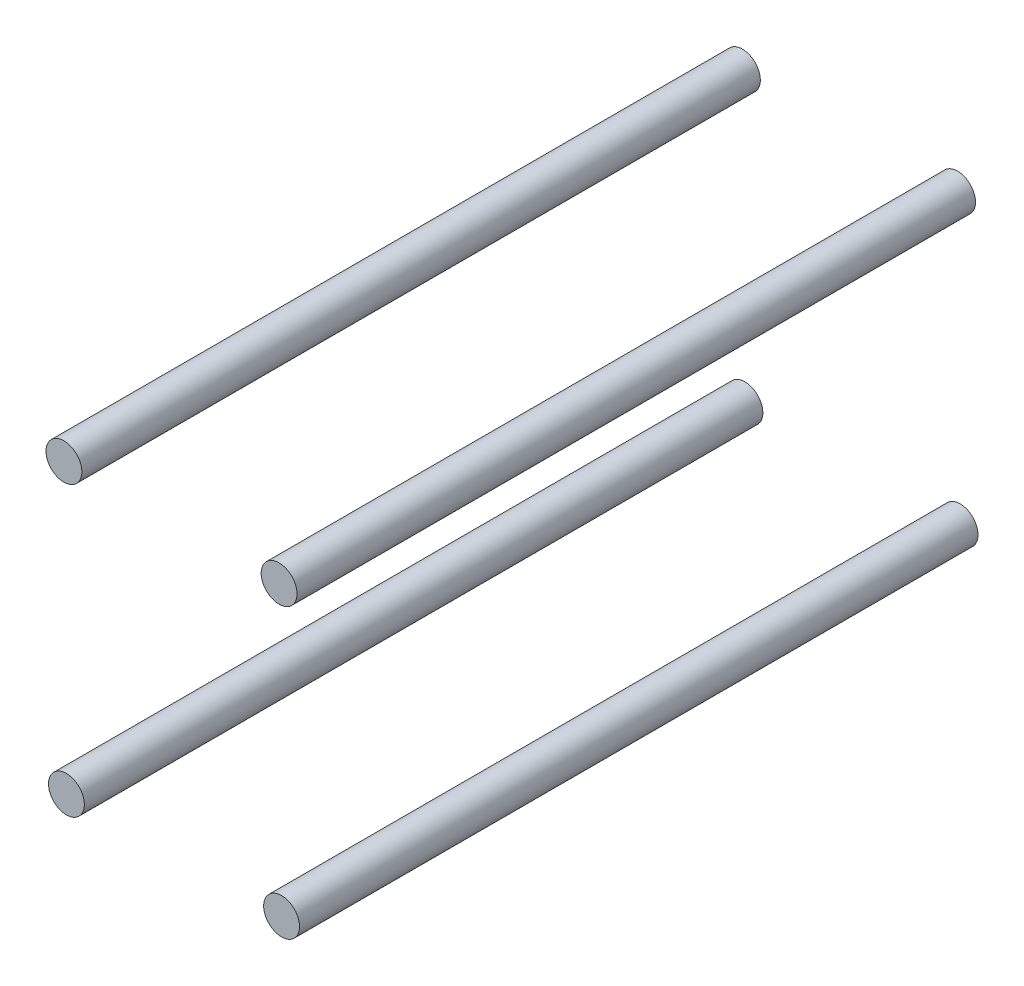
ISO-10303-21;
HEADER;
FILE_DESCRIPTION(('STEP AP214'),'2;1');
FILE_NAME('part.step','',(''),(''),'','','');
FILE_SCHEMA(('AUTOMOTIVE_DESIGN { 1 0 10303 214 1 1 1 1 }'));
ENDSEC;
DATA;
#1=APPLICATION_CONTEXT('core data for automotive mechanical design processes');
#2=APPLICATION_PROTOCOL_DEFINITION('international standard','automotive_design',2000,#1);
#3=PRODUCT_CONTEXT('',#1,'mechanical');
#4=PRODUCT('Part','Part','',(#3));
#5=PRODUCT_RELATED_PRODUCT_CATEGORY('part','',(#4));
#6=PRODUCT_DEFINITION_FORMATION('','',#4);
#7=PRODUCT_DEFINITION_CONTEXT('part definition',#1,'design');
#8=PRODUCT_DEFINITION('design','',#6,#7);
#9=PRODUCT_DEFINITION_SHAPE('','',#8);
#10=(LENGTH_UNIT() NAMED_UNIT(*) SI_UNIT(.MILLI.,.METRE.));
#11=(NAMED_UNIT(*) PLANE_ANGLE_UNIT() SI_UNIT($,.RADIAN.));
#12=(NAMED_UNIT(*) SI_UNIT($,.STERADIAN.) SOLID_ANGLE_UNIT());
#13=UNCERTAINTY_MEASURE_WITH_UNIT(LENGTH_MEASURE(1.E-05),#10,'distance_accuracy_value','');
#14=(GEOMETRIC_REPRESENTATION_CONTEXT(3) GLOBAL_UNCERTAINTY_ASSIGNED_CONTEXT((#13)) GLOBAL_UNIT_ASSIGNED_CONTEXT((#10,
#11,#12)) REPRESENTATION_CONTEXT('',''));
#15=CARTESIAN_POINT('',(0.,0.,0.));
#16=DIRECTION('',(0.,0.,1.));
#17=DIRECTION('',(1.,0.,0.));
#18=AXIS2_PLACEMENT_3D('',#15,#16,#17);
#19=CARTESIAN_POINT('',(3.80214117634224,9.09291491599282,6.42002499999992));
#20=DIRECTION('',(0.,0.,1.));
#21=DIRECTION('',(0.,-1.,0.));
#22=AXIS2_PLACEMENT_3D('',#19,#20,#21);
#23=PLANE('',#22);
#24=CARTESIAN_POINT('',(5.33699020293199,5.1061570269837,6.42002499999991));
#25=DIRECTION('',(0.,0.,1.));
#26=DIRECTION('',(0.,-1.,0.));
#27=AXIS2_PLACEMENT_3D('',#24,#25,#26);
#28=CIRCLE('',#27,0.25);
#29=CARTESIAN_POINT('',(5.33699020293199,4.8561570269837,6.42002499999991));
#30=VERTEX_POINT('',#29);
#31=EDGE_CURVE('P0_E18',#30,#30,#28,.F.);
#32=ORIENTED_EDGE('',*,*,#31,.F.);
#33=EDGE_LOOP('',(#32));
#34=FACE_BOUND('',#33,.T.);
#35=ADVANCED_FACE('P0_F15',(#34),#23,.T.);
#36=CARTESIAN_POINT('',(3.80214117634224,9.09291491599286,-3.03997500000008));
#37=DIRECTION('',(0.,0.,1.));
#38=DIRECTION('',(0.,-1.,0.));
#39=AXIS2_PLACEMENT_3D('',#36,#37,#38);
#40=PLANE('',#39);
#41=CARTESIAN_POINT('',(5.33699020293199,5.10615702698373,-3.03997500000009));
#42=DIRECTION('',(0.,0.,1.));
#43=DIRECTION('',(0.,-1.,0.));
#44=AXIS2_PLACEMENT_3D('',#41,#42,#43);
#45=CIRCLE('',#44,0.25);
#46=CARTESIAN_POINT('',(5.33699020293199,4.85615702698373,-3.03997500000009));
#47=VERTEX_POINT('',#46);
#48=EDGE_CURVE('P0_E10',#47,#47,#45,.T.);
#49=ORIENTED_EDGE('',*,*,#48,.F.);
#50=EDGE_LOOP('',(#49));
#51=FACE_BOUND('',#50,.T.);
#52=ADVANCED_FACE('P0_F30',(#51),#40,.F.);
#53=CARTESIAN_POINT('',(5.33699020293199,5.10615702698373,-3.03997500000009));
#54=DIRECTION('',(0.,0.,1.));
#55=DIRECTION('',(0.,-1.,0.));
#56=AXIS2_PLACEMENT_3D('',#53,#54,#55);
#57=CYLINDRICAL_SURFACE('',#56,0.25);
#58=ORIENTED_EDGE('',*,*,#31,.T.);
#59=EDGE_LOOP('',(#58));
#60=FACE_BOUND('',#59,.T.);
#61=ORIENTED_EDGE('',*,*,#48,.T.);
#62=EDGE_LOOP('',(#61));
#63=FACE_BOUND('',#62,.T.);
#64=ADVANCED_FACE('P0_F27',(#60,#63),#57,.T.);
#65=CLOSED_SHELL('',(#35,#52,#64));
#66=MANIFOLD_SOLID_BREP('P0_B1',#65);
#67=CARTESIAN_POINT('',(3.80214117634224,9.09291491599286,-3.03997500000008));
#68=DIRECTION('',(0.,0.,1.));
#69=DIRECTION('',(0.,-1.,0.));
#70=AXIS2_PLACEMENT_3D('',#67,#68,#69);
#71=PLANE('',#70);
#72=CARTESIAN_POINT('',(5.3020840609385,9.10600471924041,-3.03997500000008));
#73=DIRECTION('',(0.,0.,1.));
#74=DIRECTION('',(0.,-1.,0.));
#75=AXIS2_PLACEMENT_3D('',#72,#73,#74);
#76=CIRCLE('',#75,0.25);
#77=CARTESIAN_POINT('',(5.3020840609385,8.85600471924041,-3.03997500000008));
#78=VERTEX_POINT('',#77);
#79=EDGE_CURVE('P1_E18',#78,#78,#76,.T.);
#80=ORIENTED_EDGE('',*,*,#79,.F.);
#81=EDGE_LOOP('',(#80));
#82=FACE_BOUND('',#81,.T.);
#83=ADVANCED_FACE('P1_F15',(#82),#71,.F.);
#84=CARTESIAN_POINT('',(3.80214117634224,9.09291491599282,6.42002499999992));
#85=DIRECTION('',(0.,0.,1.));
#86=DIRECTION('',(0.,-1.,0.));
#87=AXIS2_PLACEMENT_3D('',#84,#85,#86);
#88=PLANE('',#87);
#89=CARTESIAN_POINT('',(5.3020840609385,9.10600471924037,6.42002499999992));
#90=DIRECTION('',(0.,0.,1.));
#91=DIRECTION('',(0.,-1.,0.));
#92=AXIS2_PLACEMENT_3D('',#89,#90,#91);
#93=CIRCLE('',#92,0.25);
#94=CARTESIAN_POINT('',(5.3020840609385,8.85600471924037,6.42002499999992));
#95=VERTEX_POINT('',#94);
#96=EDGE_CURVE('P1_E10',#95,#95,#93,.F.);
#97=ORIENTED_EDGE('',*,*,#96,.F.);
#98=EDGE_LOOP('',(#97));
#99=FACE_BOUND('',#98,.T.);
#100=ADVANCED_FACE('P1_F30',(#99),#88,.T.);
#101=CARTESIAN_POINT('',(5.3020840609385,9.10600471924041,-3.03997500000008));
#102=DIRECTION('',(0.,0.,1.));
#103=DIRECTION('',(0.,-1.,0.));
#104=AXIS2_PLACEMENT_3D('',#101,#102,#103);
#105=CYLINDRICAL_SURFACE('',#104,0.25);
#106=ORIENTED_EDGE('',*,*,#79,.T.);
#107=EDGE_LOOP('',(#106));
#108=FACE_BOUND('',#107,.T.);
#109=ORIENTED_EDGE('',*,*,#96,.T.);
#110=EDGE_LOOP('',(#109));
#111=FACE_BOUND('',#110,.T.);
#112=ADVANCED_FACE('P1_F27',(#108,#111),#105,.T.);
#113=CLOSED_SHELL('',(#83,#100,#112));
#114=MANIFOLD_SOLID_BREP('P1_B1',#113);
#115=CARTESIAN_POINT('',(3.80214117634224,9.09291491599282,6.42002499999992));
#116=DIRECTION('',(0.,0.,1.));
#117=DIRECTION('',(0.,-1.,0.));
#118=AXIS2_PLACEMENT_3D('',#115,#116,#117);
#119=PLANE('',#118);
#120=CARTESIAN_POINT('',(2.33710443373948,5.07997742048858,6.42002499999991));
#121=DIRECTION('',(0.,0.,1.));
#122=DIRECTION('',(0.,-1.,0.));
#123=AXIS2_PLACEMENT_3D('',#120,#121,#122);
#124=CIRCLE('',#123,0.25);
#125=CARTESIAN_POINT('',(2.33710443373948,4.82997742048858,6.42002499999991));
#126=VERTEX_POINT('',#125);
#127=EDGE_CURVE('P2_E18',#126,#126,#124,.F.);
#128=ORIENTED_EDGE('',*,*,#127,.F.);
#129=EDGE_LOOP('',(#128));
#130=FACE_BOUND('',#129,.T.);
#131=ADVANCED_FACE('P2_F15',(#130),#119,.T.);
#132=CARTESIAN_POINT('',(3.80214117634224,9.09291491599286,-3.03997500000008));
#133=DIRECTION('',(0.,0.,1.));
#134=DIRECTION('',(0.,-1.,0.));
#135=AXIS2_PLACEMENT_3D('',#132,#133,#134);
#136=PLANE('',#135);
#137=CARTESIAN_POINT('',(2.33710443373948,5.07997742048861,-3.03997500000009));
#138=DIRECTION('',(0.,0.,1.));
#139=DIRECTION('',(0.,-1.,0.));
#140=AXIS2_PLACEMENT_3D('',#137,#138,#139);
#141=CIRCLE('',#140,0.25);
#142=CARTESIAN_POINT('',(2.33710443373948,4.82997742048861,-3.03997500000009));
#143=VERTEX_POINT('',#142);
#144=EDGE_CURVE('P2_E10',#143,#143,#141,.T.);
#145=ORIENTED_EDGE('',*,*,#144,.F.);
#146=EDGE_LOOP('',(#145));
#147=FACE_BOUND('',#146,.T.);
#148=ADVANCED_FACE('P2_F30',(#147),#136,.F.);
#149=CARTESIAN_POINT('',(2.33710443373948,5.07997742048861,-3.03997500000009));
#150=DIRECTION('',(0.,0.,1.));
#151=DIRECTION('',(0.,-1.,0.));
#152=AXIS2_PLACEMENT_3D('',#149,#150,#151);
#153=CYLINDRICAL_SURFACE('',#152,0.25);
#154=ORIENTED_EDGE('',*,*,#127,.T.);
#155=EDGE_LOOP('',(#154));
#156=FACE_BOUND('',#155,.T.);
#157=ORIENTED_EDGE('',*,*,#144,.T.);
#158=EDGE_LOOP('',(#157));
#159=FACE_BOUND('',#158,.T.);
#160=ADVANCED_FACE('P2_F27',(#156,#159),#153,.T.);
#161=CLOSED_SHELL('',(#131,#148,#160));
#162=MANIFOLD_SOLID_BREP('P2_B1',#161);
#163=CARTESIAN_POINT('',(3.80214117634224,9.09291491599282,6.42002499999992));
#164=DIRECTION('',(0.,0.,1.));
#165=DIRECTION('',(0.,-1.,0.));
#166=AXIS2_PLACEMENT_3D('',#163,#164,#165);
#167=PLANE('',#166);
#168=CARTESIAN_POINT('',(2.30219829174598,9.07982511274527,6.42002499999992));
#169=DIRECTION('',(0.,0.,1.));
#170=DIRECTION('',(0.,-1.,0.));
#171=AXIS2_PLACEMENT_3D('',#168,#169,#170);
#172=CIRCLE('',#171,0.25);
#173=CARTESIAN_POINT('',(2.30219829174598,8.82982511274527,6.42002499999992));
#174=VERTEX_POINT('',#173);
#175=EDGE_CURVE('P3_E18',#174,#174,#172,.F.);
#176=ORIENTED_EDGE('',*,*,#175,.F.);
#177=EDGE_LOOP('',(#176));
#178=FACE_BOUND('',#177,.T.);
#179=ADVANCED_FACE('P3_F15',(#178),#167,.T.);
#180=CARTESIAN_POINT('',(3.80214117634224,9.09291491599286,-3.03997500000008));
#181=DIRECTION('',(0.,0.,1.));
#182=DIRECTION('',(0.,-1.,0.));
#183=AXIS2_PLACEMENT_3D('',#180,#181,#182);
#184=PLANE('',#183);
#185=CARTESIAN_POINT('',(2.30219829174598,9.0798251127453,-3.03997500000008));
#186=DIRECTION('',(0.,0.,1.));
#187=DIRECTION('',(0.,-1.,0.));
#188=AXIS2_PLACEMENT_3D('',#185,#186,#187);
#189=CIRCLE('',#188,0.25);
#190=CARTESIAN_POINT('',(2.30219829174598,8.8298251127453,-3.03997500000008));
#191=VERTEX_POINT('',#190);
#192=EDGE_CURVE('P3_E10',#191,#191,#189,.T.);
#193=ORIENTED_EDGE('',*,*,#192,.F.);
#194=EDGE_LOOP('',(#193));
#195=FACE_BOUND('',#194,.T.);
#196=ADVANCED_FACE('P3_F30',(#195),#184,.F.);
#197=CARTESIAN_POINT('',(2.30219829174598,9.0798251127453,-3.03997500000008));
#198=DIRECTION('',(0.,0.,1.));
#199=DIRECTION('',(0.,-1.,0.));
#200=AXIS2_PLACEMENT_3D('',#197,#198,#199);
#201=CYLINDRICAL_SURFACE('',#200,0.25);
#202=ORIENTED_EDGE('',*,*,#175,.T.);
#203=EDGE_LOOP('',(#202));
#204=FACE_BOUND('',#203,.T.);
#205=ORIENTED_EDGE('',*,*,#192,.T.);
#206=EDGE_LOOP('',(#205));
#207=FACE_BOUND('',#206,.T.);
#208=ADVANCED_FACE('P3_F27',(#204,#207),#201,.T.);
#209=CLOSED_SHELL('',(#179,#196,#208));
#210=MANIFOLD_SOLID_BREP('P3_B1',#209);
#211=ADVANCED_BREP_SHAPE_REPRESENTATION('',(#18,#66,#114,#162,#210),#14);
#212=SHAPE_DEFINITION_REPRESENTATION(#9,#211);
ENDSEC;
END-ISO-10303-21;
